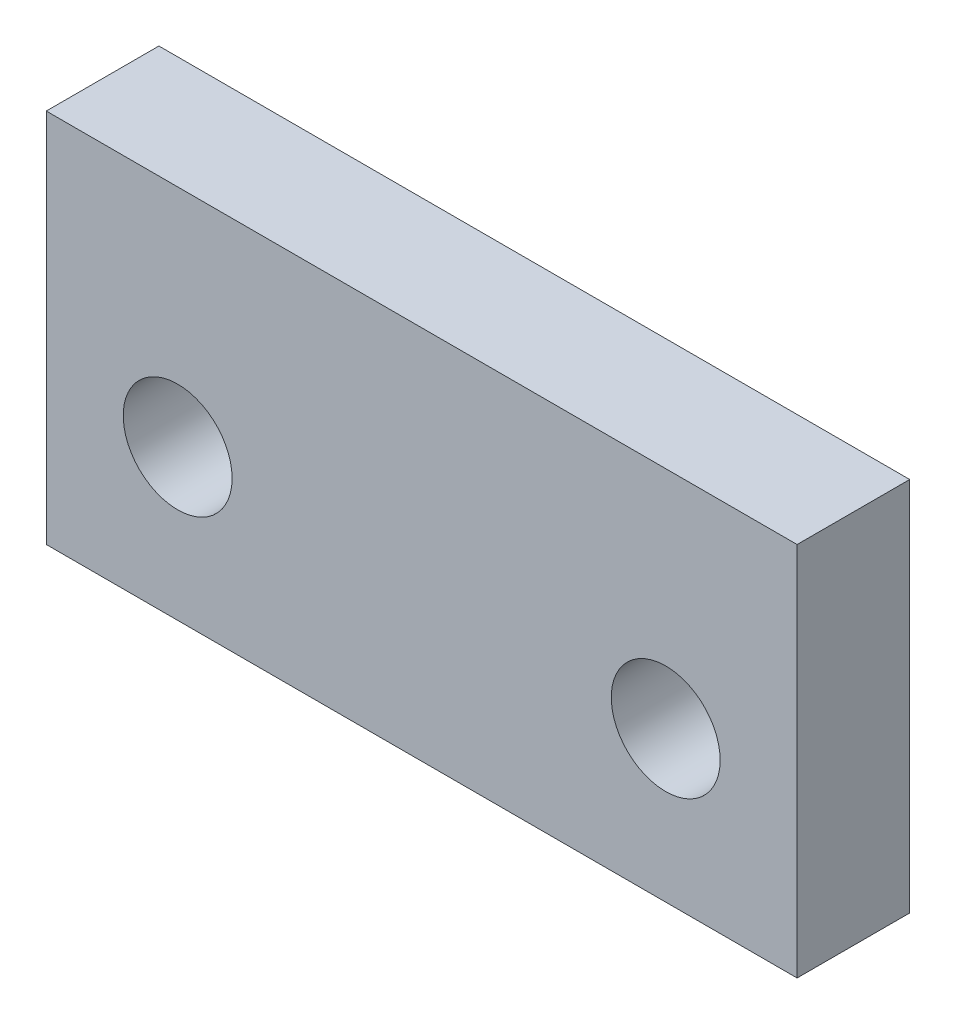
ISO-10303-21;
HEADER;
FILE_DESCRIPTION(('STEP AP214'),'2;1');
FILE_NAME('part.step','',(''),(''),'','','');
FILE_SCHEMA(('AUTOMOTIVE_DESIGN { 1 0 10303 214 1 1 1 1 }'));
ENDSEC;
DATA;
#1=APPLICATION_CONTEXT('core data for automotive mechanical design processes');
#2=APPLICATION_PROTOCOL_DEFINITION('international standard','automotive_design',2000,#1);
#3=PRODUCT_CONTEXT('',#1,'mechanical');
#4=PRODUCT('Part','Part','',(#3));
#5=PRODUCT_RELATED_PRODUCT_CATEGORY('part','',(#4));
#6=PRODUCT_DEFINITION_FORMATION('','',#4);
#7=PRODUCT_DEFINITION_CONTEXT('part definition',#1,'design');
#8=PRODUCT_DEFINITION('design','',#6,#7);
#9=PRODUCT_DEFINITION_SHAPE('','',#8);
#10=(LENGTH_UNIT() NAMED_UNIT(*) SI_UNIT(.MILLI.,.METRE.));
#11=(NAMED_UNIT(*) PLANE_ANGLE_UNIT() SI_UNIT($,.RADIAN.));
#12=(NAMED_UNIT(*) SI_UNIT($,.STERADIAN.) SOLID_ANGLE_UNIT());
#13=UNCERTAINTY_MEASURE_WITH_UNIT(LENGTH_MEASURE(1.E-05),#10,'distance_accuracy_value','');
#14=(GEOMETRIC_REPRESENTATION_CONTEXT(3) GLOBAL_UNCERTAINTY_ASSIGNED_CONTEXT((#13)) GLOBAL_UNIT_ASSIGNED_CONTEXT((#10,
#11,#12)) REPRESENTATION_CONTEXT('',''));
#15=CARTESIAN_POINT('',(0.,0.,0.));
#16=DIRECTION('',(0.,0.,1.));
#17=DIRECTION('',(1.,0.,0.));
#18=AXIS2_PLACEMENT_3D('',#15,#16,#17);
#19=CARTESIAN_POINT('',(0.,0.,3.));
#20=DIRECTION('',(0.,0.,1.));
#21=DIRECTION('',(1.,0.,0.));
#22=AXIS2_PLACEMENT_3D('',#19,#20,#21);
#23=PLANE('',#22);
#24=CARTESIAN_POINT('',(3.5,-6.,3.));
#25=DIRECTION('',(0.,0.,1.));
#26=DIRECTION('',(1.,0.,0.));
#27=AXIS2_PLACEMENT_3D('',#24,#25,#26);
#28=CIRCLE('',#27,1.45);
#29=CARTESIAN_POINT('',(4.95,-6.,3.));
#30=VERTEX_POINT('',#29);
#31=EDGE_CURVE('E102',#30,#30,#28,.T.);
#32=ORIENTED_EDGE('',*,*,#31,.F.);
#33=EDGE_LOOP('',(#32));
#34=FACE_BOUND('',#33,.T.);
#35=DIRECTION('',(0.,-1.,0.));
#36=VECTOR('',#35,1.);
#37=CARTESIAN_POINT('',(0.,0.,3.));
#38=LINE('',#37,#36);
#39=CARTESIAN_POINT('',(0.,0.,3.));
#40=VERTEX_POINT('',#39);
#41=CARTESIAN_POINT('',(0.,-10.,3.));
#42=VERTEX_POINT('',#41);
#43=EDGE_CURVE('E87',#40,#42,#38,.T.);
#44=ORIENTED_EDGE('',*,*,#43,.T.);
#45=DIRECTION('',(1.,0.,0.));
#46=VECTOR('',#45,1.);
#47=CARTESIAN_POINT('',(0.,-10.,3.));
#48=LINE('',#47,#46);
#49=CARTESIAN_POINT('',(20.,-10.,3.));
#50=VERTEX_POINT('',#49);
#51=EDGE_CURVE('E82',#42,#50,#48,.T.);
#52=ORIENTED_EDGE('',*,*,#51,.T.);
#53=DIRECTION('',(0.,1.,0.));
#54=VECTOR('',#53,1.);
#55=CARTESIAN_POINT('',(20.,0.,3.));
#56=LINE('',#55,#54);
#57=CARTESIAN_POINT('',(20.,0.,3.));
#58=VERTEX_POINT('',#57);
#59=EDGE_CURVE('E85',#50,#58,#56,.T.);
#60=ORIENTED_EDGE('',*,*,#59,.T.);
#61=DIRECTION('',(-1.,0.,0.));
#62=VECTOR('',#61,1.);
#63=CARTESIAN_POINT('',(0.,0.,3.));
#64=LINE('',#63,#62);
#65=EDGE_CURVE('E52',#58,#40,#64,.T.);
#66=ORIENTED_EDGE('',*,*,#65,.T.);
#67=EDGE_LOOP('',(#44,#52,#60,#66));
#68=FACE_BOUND('',#67,.T.);
#69=CARTESIAN_POINT('',(16.5,-6.,3.));
#70=DIRECTION('',(0.,0.,1.));
#71=DIRECTION('',(1.,0.,0.));
#72=AXIS2_PLACEMENT_3D('',#69,#70,#71);
#73=CIRCLE('',#72,1.45);
#74=CARTESIAN_POINT('',(17.95,-6.,3.));
#75=VERTEX_POINT('',#74);
#76=EDGE_CURVE('E117',#75,#75,#73,.T.);
#77=ORIENTED_EDGE('',*,*,#76,.F.);
#78=EDGE_LOOP('',(#77));
#79=FACE_BOUND('',#78,.T.);
#80=ADVANCED_FACE('F35',(#34,#68,#79),#23,.T.);
#81=CARTESIAN_POINT('',(0.,0.,0.));
#82=DIRECTION('',(0.,0.,1.));
#83=DIRECTION('',(1.,0.,0.));
#84=AXIS2_PLACEMENT_3D('',#81,#82,#83);
#85=PLANE('',#84);
#86=DIRECTION('',(0.,-1.,0.));
#87=VECTOR('',#86,1.);
#88=CARTESIAN_POINT('',(0.,0.,0.));
#89=LINE('',#88,#87);
#90=CARTESIAN_POINT('',(0.,0.,0.));
#91=VERTEX_POINT('',#90);
#92=CARTESIAN_POINT('',(0.,-10.,0.));
#93=VERTEX_POINT('',#92);
#94=EDGE_CURVE('E99',#91,#93,#89,.T.);
#95=ORIENTED_EDGE('',*,*,#94,.F.);
#96=DIRECTION('',(-1.,0.,0.));
#97=VECTOR('',#96,1.);
#98=CARTESIAN_POINT('',(0.,0.,0.));
#99=LINE('',#98,#97);
#100=CARTESIAN_POINT('',(20.,0.,0.));
#101=VERTEX_POINT('',#100);
#102=EDGE_CURVE('E75',#101,#91,#99,.T.);
#103=ORIENTED_EDGE('',*,*,#102,.F.);
#104=DIRECTION('',(0.,1.,0.));
#105=VECTOR('',#104,1.);
#106=CARTESIAN_POINT('',(20.,0.,0.));
#107=LINE('',#106,#105);
#108=CARTESIAN_POINT('',(20.,-10.,0.));
#109=VERTEX_POINT('',#108);
#110=EDGE_CURVE('E69',#109,#101,#107,.T.);
#111=ORIENTED_EDGE('',*,*,#110,.F.);
#112=DIRECTION('',(1.,0.,0.));
#113=VECTOR('',#112,1.);
#114=CARTESIAN_POINT('',(0.,-10.,0.));
#115=LINE('',#114,#113);
#116=EDGE_CURVE('E91',#93,#109,#115,.T.);
#117=ORIENTED_EDGE('',*,*,#116,.F.);
#118=EDGE_LOOP('',(#95,#103,#111,#117));
#119=FACE_BOUND('',#118,.T.);
#120=CARTESIAN_POINT('',(3.5,-6.,0.));
#121=DIRECTION('',(0.,0.,1.));
#122=DIRECTION('',(1.,0.,0.));
#123=AXIS2_PLACEMENT_3D('',#120,#121,#122);
#124=CIRCLE('',#123,1.45);
#125=CARTESIAN_POINT('',(4.95,-6.,0.));
#126=VERTEX_POINT('',#125);
#127=EDGE_CURVE('E114',#126,#126,#124,.T.);
#128=ORIENTED_EDGE('',*,*,#127,.T.);
#129=EDGE_LOOP('',(#128));
#130=FACE_BOUND('',#129,.T.);
#131=CARTESIAN_POINT('',(16.5,-6.,0.));
#132=DIRECTION('',(0.,0.,1.));
#133=DIRECTION('',(1.,0.,0.));
#134=AXIS2_PLACEMENT_3D('',#131,#132,#133);
#135=CIRCLE('',#134,1.45);
#136=CARTESIAN_POINT('',(17.95,-6.,0.));
#137=VERTEX_POINT('',#136);
#138=EDGE_CURVE('E120',#137,#137,#135,.T.);
#139=ORIENTED_EDGE('',*,*,#138,.T.);
#140=EDGE_LOOP('',(#139));
#141=FACE_BOUND('',#140,.T.);
#142=ADVANCED_FACE('F110',(#119,#130,#141),#85,.F.);
#143=CARTESIAN_POINT('',(0.,0.,3.));
#144=DIRECTION('',(1.,0.,0.));
#145=DIRECTION('',(0.,1.,0.));
#146=AXIS2_PLACEMENT_3D('',#143,#144,#145);
#147=PLANE('',#146);
#148=ORIENTED_EDGE('',*,*,#94,.T.);
#149=DIRECTION('',(0.,0.,-1.));
#150=VECTOR('',#149,1.);
#151=CARTESIAN_POINT('',(0.,-10.,3.));
#152=LINE('',#151,#150);
#153=EDGE_CURVE('E11',#42,#93,#152,.T.);
#154=ORIENTED_EDGE('',*,*,#153,.F.);
#155=ORIENTED_EDGE('',*,*,#43,.F.);
#156=DIRECTION('',(0.,0.,-1.));
#157=VECTOR('',#156,1.);
#158=CARTESIAN_POINT('',(0.,0.,3.));
#159=LINE('',#158,#157);
#160=EDGE_CURVE('E95',#40,#91,#159,.T.);
#161=ORIENTED_EDGE('',*,*,#160,.T.);
#162=EDGE_LOOP('',(#148,#154,#155,#161));
#163=FACE_BOUND('',#162,.T.);
#164=ADVANCED_FACE('F37',(#163),#147,.F.);
#165=CARTESIAN_POINT('',(0.,-10.,3.));
#166=DIRECTION('',(0.,1.,0.));
#167=DIRECTION('',(0.,0.,1.));
#168=AXIS2_PLACEMENT_3D('',#165,#166,#167);
#169=PLANE('',#168);
#170=ORIENTED_EDGE('',*,*,#116,.T.);
#171=DIRECTION('',(0.,0.,-1.));
#172=VECTOR('',#171,1.);
#173=CARTESIAN_POINT('',(20.,-10.,3.));
#174=LINE('',#173,#172);
#175=EDGE_CURVE('E44',#50,#109,#174,.T.);
#176=ORIENTED_EDGE('',*,*,#175,.F.);
#177=ORIENTED_EDGE('',*,*,#51,.F.);
#178=ORIENTED_EDGE('',*,*,#153,.T.);
#179=EDGE_LOOP('',(#170,#176,#177,#178));
#180=FACE_BOUND('',#179,.T.);
#181=ADVANCED_FACE('F90',(#180),#169,.F.);
#182=CARTESIAN_POINT('',(20.,0.,3.));
#183=DIRECTION('',(-1.,0.,0.));
#184=DIRECTION('',(0.,0.,1.));
#185=AXIS2_PLACEMENT_3D('',#182,#183,#184);
#186=PLANE('',#185);
#187=ORIENTED_EDGE('',*,*,#110,.T.);
#188=DIRECTION('',(0.,0.,-1.));
#189=VECTOR('',#188,1.);
#190=CARTESIAN_POINT('',(20.,0.,3.));
#191=LINE('',#190,#189);
#192=EDGE_CURVE('E92',#58,#101,#191,.T.);
#193=ORIENTED_EDGE('',*,*,#192,.F.);
#194=ORIENTED_EDGE('',*,*,#59,.F.);
#195=ORIENTED_EDGE('',*,*,#175,.T.);
#196=EDGE_LOOP('',(#187,#193,#194,#195));
#197=FACE_BOUND('',#196,.T.);
#198=ADVANCED_FACE('F93',(#197),#186,.F.);
#199=CARTESIAN_POINT('',(0.,0.,3.));
#200=DIRECTION('',(0.,-1.,0.));
#201=DIRECTION('',(0.,0.,-1.));
#202=AXIS2_PLACEMENT_3D('',#199,#200,#201);
#203=PLANE('',#202);
#204=ORIENTED_EDGE('',*,*,#102,.T.);
#205=ORIENTED_EDGE('',*,*,#160,.F.);
#206=ORIENTED_EDGE('',*,*,#65,.F.);
#207=ORIENTED_EDGE('',*,*,#192,.T.);
#208=EDGE_LOOP('',(#204,#205,#206,#207));
#209=FACE_BOUND('',#208,.T.);
#210=ADVANCED_FACE('F107',(#209),#203,.F.);
#211=CARTESIAN_POINT('',(3.5,-6.,3.));
#212=DIRECTION('',(0.,0.,-1.));
#213=DIRECTION('',(-1.,0.,0.));
#214=AXIS2_PLACEMENT_3D('',#211,#212,#213);
#215=CYLINDRICAL_SURFACE('',#214,1.45);
#216=ORIENTED_EDGE('',*,*,#31,.T.);
#217=EDGE_LOOP('',(#216));
#218=FACE_BOUND('',#217,.T.);
#219=ORIENTED_EDGE('',*,*,#127,.F.);
#220=EDGE_LOOP('',(#219));
#221=FACE_BOUND('',#220,.T.);
#222=ADVANCED_FACE('F137',(#218,#221),#215,.F.);
#223=CARTESIAN_POINT('',(16.5,-6.,3.));
#224=DIRECTION('',(0.,0.,-1.));
#225=DIRECTION('',(-1.,0.,0.));
#226=AXIS2_PLACEMENT_3D('',#223,#224,#225);
#227=CYLINDRICAL_SURFACE('',#226,1.45);
#228=ORIENTED_EDGE('',*,*,#76,.T.);
#229=EDGE_LOOP('',(#228));
#230=FACE_BOUND('',#229,.T.);
#231=ORIENTED_EDGE('',*,*,#138,.F.);
#232=EDGE_LOOP('',(#231));
#233=FACE_BOUND('',#232,.T.);
#234=ADVANCED_FACE('F126',(#230,#233),#227,.F.);
#235=CLOSED_SHELL('',(#80,#142,#164,#181,#198,#210,#222,#234));
#236=MANIFOLD_SOLID_BREP('B2',#235);
#237=ADVANCED_BREP_SHAPE_REPRESENTATION('',(#18,#236),#14);
#238=SHAPE_DEFINITION_REPRESENTATION(#9,#237);
ENDSEC;
END-ISO-10303-21;
